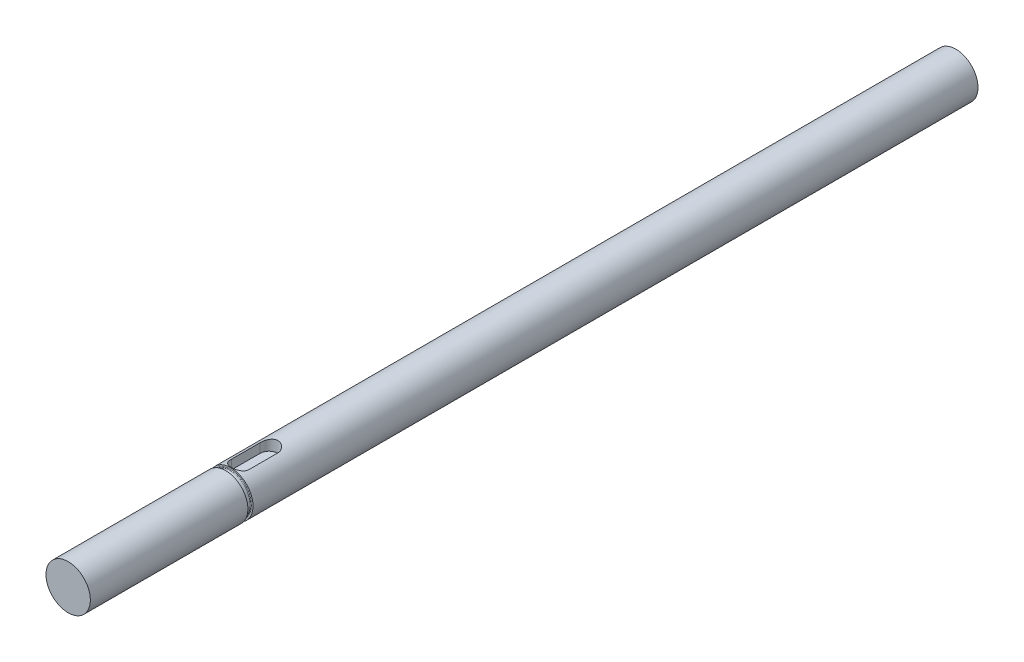
ISO-10303-21;
HEADER;
FILE_DESCRIPTION(('STEP AP214'),'2;1');
FILE_NAME('part.step','',(''),(''),'','','');
FILE_SCHEMA(('AUTOMOTIVE_DESIGN { 1 0 10303 214 1 1 1 1 }'));
ENDSEC;
DATA;
#1=APPLICATION_CONTEXT('core data for automotive mechanical design processes');
#2=APPLICATION_PROTOCOL_DEFINITION('international standard','automotive_design',2000,#1);
#3=PRODUCT_CONTEXT('',#1,'mechanical');
#4=PRODUCT('Part','Part','',(#3));
#5=PRODUCT_RELATED_PRODUCT_CATEGORY('part','',(#4));
#6=PRODUCT_DEFINITION_FORMATION('','',#4);
#7=PRODUCT_DEFINITION_CONTEXT('part definition',#1,'design');
#8=PRODUCT_DEFINITION('design','',#6,#7);
#9=PRODUCT_DEFINITION_SHAPE('','',#8);
#10=(LENGTH_UNIT() NAMED_UNIT(*) SI_UNIT(.MILLI.,.METRE.));
#11=(NAMED_UNIT(*) PLANE_ANGLE_UNIT() SI_UNIT($,.RADIAN.));
#12=(NAMED_UNIT(*) SI_UNIT($,.STERADIAN.) SOLID_ANGLE_UNIT());
#13=UNCERTAINTY_MEASURE_WITH_UNIT(LENGTH_MEASURE(1.E-05),#10,'distance_accuracy_value','');
#14=(GEOMETRIC_REPRESENTATION_CONTEXT(3) GLOBAL_UNCERTAINTY_ASSIGNED_CONTEXT((#13)) GLOBAL_UNIT_ASSIGNED_CONTEXT((#10,
#11,#12)) REPRESENTATION_CONTEXT('',''));
#15=CARTESIAN_POINT('',(0.,0.,0.));
#16=DIRECTION('',(0.,0.,1.));
#17=DIRECTION('',(1.,0.,0.));
#18=AXIS2_PLACEMENT_3D('',#15,#16,#17);
#19=CARTESIAN_POINT('',(0.,0.,100.));
#20=DIRECTION('',(0.,0.,-1.));
#21=DIRECTION('',(-1.,0.,0.));
#22=AXIS2_PLACEMENT_3D('',#19,#20,#21);
#23=CYLINDRICAL_SURFACE('',#22,5.);
#24=CARTESIAN_POINT('',(-1.99999999999998,4.58257569495585,61.25));
#25=CARTESIAN_POINT('',(-2.00000798036346,4.58256464470382,61.3038058525026));
#26=CARTESIAN_POINT('',(-1.99782891366023,4.58352306077323,61.3576056655577));
#27=CARTESIAN_POINT('',(-1.98915905973445,4.58729625417544,61.4647712982547));
#28=CARTESIAN_POINT('',(-1.98266991468791,4.59011032448546,61.518137275356));
#29=CARTESIAN_POINT('',(-1.96547603676368,4.5974978292064,61.6238468215588));
#30=CARTESIAN_POINT('',(-1.95478796820432,4.60206430717534,61.676193584044));
#31=CARTESIAN_POINT('',(-1.92931630190659,4.61280053296683,61.7797007717145));
#32=CARTESIAN_POINT('',(-1.91453245417089,4.61897037865399,61.8308611242772));
#33=CARTESIAN_POINT('',(-1.86426971793521,4.63959291248422,61.981935850582));
#34=CARTESIAN_POINT('',(-1.82284489460006,4.65617449157431,62.0796542306897));
#35=CARTESIAN_POINT('',(-1.72548191592175,4.69312370765381,62.2667955800826));
#36=CARTESIAN_POINT('',(-1.66952996336924,4.71349493864008,62.3562105529617));
#37=CARTESIAN_POINT('',(-1.54131835736853,4.75700999402115,62.5292623966742));
#38=CARTESIAN_POINT('',(-1.46836913992728,4.78024245635517,62.6123672169202));
#39=CARTESIAN_POINT('',(-1.30969646176207,4.82612790548656,62.7655402722107));
#40=CARTESIAN_POINT('',(-1.2239703849968,4.84878077249721,62.8356058308657));
#41=CARTESIAN_POINT('',(-1.03800590808967,4.89203417106082,62.9634063941957));
#42=CARTESIAN_POINT('',(-0.937327933050951,4.91251824543531,63.0205448092619));
#43=CARTESIAN_POINT('',(-0.7268241432467,4.94803944125004,63.1168440726887));
#44=CARTESIAN_POINT('',(-0.617002169026234,4.96307883544185,63.1560124240517));
#45=CARTESIAN_POINT('',(-0.39696744129568,4.98538314653816,63.2133412013106));
#46=CARTESIAN_POINT('',(-0.287031054523049,4.99298922547927,63.2324269509057));
#47=CARTESIAN_POINT('',(-0.0652684304565053,5.00080310201085,63.2520284799456));
#48=CARTESIAN_POINT('',(0.0465571232841751,5.0010135205303,63.2525508380235));
#49=CARTESIAN_POINT('',(0.262233376226791,4.99421960045302,63.2355171608401));
#50=CARTESIAN_POINT('',(0.366179202506797,4.98761985585461,63.218974953326));
#51=CARTESIAN_POINT('',(0.569674786500935,4.96849270441446,63.1700065729465));
#52=CARTESIAN_POINT('',(0.669224295072849,4.95596496209929,63.1375795011314));
#53=CARTESIAN_POINT('',(0.862897539070301,4.92596830598785,63.0573637035755));
#54=CARTESIAN_POINT('',(0.956916851366443,4.90842774755848,63.0093507591896));
#55=CARTESIAN_POINT('',(1.13580746919776,4.87014602008043,62.8995354114048));
#56=CARTESIAN_POINT('',(1.22067554984698,4.84940372896448,62.8377281703094));
#57=CARTESIAN_POINT('',(1.38476339273627,4.80521782746143,62.6973558197415));
#58=CARTESIAN_POINT('',(1.4632477030894,4.78168627172884,62.61795752533));
#59=CARTESIAN_POINT('',(1.60609926099478,4.7356195058465,62.4470199048523));
#60=CARTESIAN_POINT('',(1.67046007709005,4.71308475332783,62.3554750779057));
#61=CARTESIAN_POINT('',(1.78493657933605,4.67095688856025,62.1595297159788));
#62=CARTESIAN_POINT('',(1.83458932217622,4.65146702150583,62.0548351633398));
#63=CARTESIAN_POINT('',(1.91521298357264,4.61886105059582,61.8376384755705));
#64=CARTESIAN_POINT('',(1.94621696002208,4.60573367628738,61.7251505526617));
#65=CARTESIAN_POINT('',(1.9781058182572,4.59208303529493,61.551256365842));
#66=CARTESIAN_POINT('',(1.98630505165979,4.58853437680526,61.4913424506987));
#67=CARTESIAN_POINT('',(1.99725282103812,4.58377540314389,61.3709649810045));
#68=CARTESIAN_POINT('',(2.00000471568568,4.58256364711745,61.3105017882422));
#69=CARTESIAN_POINT('',(2.,4.58257569495584,61.25));
#70=B_SPLINE_CURVE_WITH_KNOTS('',3,(#24,#25,#26,#27,#28,#29,#30,#31,#32,#33,#34,#35,#36,#37,#38,
#39,#40,#41,#42,#43,#44,#45,#46,#47,#48,#49,#50,#51,#52,#53,#54,#55,#56,#57,#58,#59,#60,#61,#62,
#63,#64,#65,#66,#67,#68,#69),.UNSPECIFIED.,.F.,.F.,(4,2,2,2,2,2,2,2,2,2,2,2,2,2,2,2,2,2,2,2,2,2,
4),(0.,0.161354853098824,0.322648263883208,0.483307911251883,0.643977367092303,
0.964683001739086,1.28569434942625,1.62318047995497,1.96073580539189,2.31162858925762,
2.66237473197321,2.99613876504268,3.32978451514654,3.64468915259533,3.95961161305652,
4.27928176927544,4.59906421133017,4.9398187467515,5.28072813203931,5.63144241548458,
5.98153315592122,6.1630019255781,6.34435877193558),.UNSPECIFIED.);
#71=CARTESIAN_POINT('',(-1.99999999999998,4.58257569495585,61.25));
#72=VERTEX_POINT('',#71);
#73=CARTESIAN_POINT('',(2.,4.58257569495584,61.25));
#74=VERTEX_POINT('',#73);
#75=EDGE_CURVE('E115',#72,#74,#70,.T.);
#76=ORIENTED_EDGE('',*,*,#75,.F.);
#77=DIRECTION('',(0.,0.,-1.));
#78=VECTOR('',#77,1.);
#79=CARTESIAN_POINT('',(-2.,4.58257569495584,100.));
#80=LINE('',#79,#78);
#81=CARTESIAN_POINT('',(-1.99999999999999,4.58257569495584,54.75));
#82=VERTEX_POINT('',#81);
#83=EDGE_CURVE('E11',#82,#72,#80,.F.);
#84=ORIENTED_EDGE('',*,*,#83,.F.);
#85=CARTESIAN_POINT('',(2.,4.58257569495584,54.75));
#86=CARTESIAN_POINT('',(2.00000798036348,4.58256464470381,54.6961941474974));
#87=CARTESIAN_POINT('',(1.99782891366025,4.58352306077323,54.6423943344424));
#88=CARTESIAN_POINT('',(1.98915905973447,4.58729625417543,54.5352287017453));
#89=CARTESIAN_POINT('',(1.98266991468793,4.59011032448545,54.481862724644));
#90=CARTESIAN_POINT('',(1.9654760367637,4.59749782920639,54.3761531784412));
#91=CARTESIAN_POINT('',(1.95478796820434,4.60206430717533,54.323806415956));
#92=CARTESIAN_POINT('',(1.92931630190661,4.61280053296682,54.2202992282855));
#93=CARTESIAN_POINT('',(1.91453245417091,4.61897037865398,54.1691388757228));
#94=CARTESIAN_POINT('',(1.86426971793523,4.63959291248421,54.018064149418));
#95=CARTESIAN_POINT('',(1.82284489460008,4.6561744915743,53.9203457693103));
#96=CARTESIAN_POINT('',(1.72548191592177,4.6931237076538,53.7332044199174));
#97=CARTESIAN_POINT('',(1.66952996336926,4.71349493864007,53.6437894470384));
#98=CARTESIAN_POINT('',(1.54131835736855,4.75700999402114,53.4707376033258));
#99=CARTESIAN_POINT('',(1.46836913992731,4.78024245635516,53.3876327830798));
#100=CARTESIAN_POINT('',(1.30969646176209,4.82612790548656,53.2344597277893));
#101=CARTESIAN_POINT('',(1.22397038499682,4.84878077249721,53.1643941691343));
#102=CARTESIAN_POINT('',(1.03800590808969,4.89203417106082,53.0365936058044));
#103=CARTESIAN_POINT('',(0.937327933050968,4.91251824543531,52.9794551907381));
#104=CARTESIAN_POINT('',(0.726824143246719,4.94803944125003,52.8831559273114));
#105=CARTESIAN_POINT('',(0.617002169026255,4.96307883544185,52.8439875759483));
#106=CARTESIAN_POINT('',(0.396967441295703,4.98538314653816,52.7866587986894));
#107=CARTESIAN_POINT('',(0.287031054523071,4.99298922547927,52.7675730490944));
#108=CARTESIAN_POINT('',(0.0652684304565268,5.00080310201086,52.7479715200544));
#109=CARTESIAN_POINT('',(-0.046557123284154,5.0010135205303,52.7474491619765));
#110=CARTESIAN_POINT('',(-0.262233376226772,4.99421960045302,52.7644828391599));
#111=CARTESIAN_POINT('',(-0.366179202506779,4.98761985585461,52.781025046674));
#112=CARTESIAN_POINT('',(-0.569674786500916,4.96849270441446,52.8299934270536));
#113=CARTESIAN_POINT('',(-0.669224295072828,4.95596496209929,52.8624204988686));
#114=CARTESIAN_POINT('',(-0.86289753907028,4.92596830598785,52.9426362964245));
#115=CARTESIAN_POINT('',(-0.956916851366425,4.90842774755848,52.9906492408105));
#116=CARTESIAN_POINT('',(-1.13580746919775,4.87014602008043,53.1004645885952));
#117=CARTESIAN_POINT('',(-1.22067554984696,4.84940372896449,53.1622718296906));
#118=CARTESIAN_POINT('',(-1.38476339273625,4.80521782746144,53.3026441802585));
#119=CARTESIAN_POINT('',(-1.46324770308938,4.78168627172885,53.38204247467));
#120=CARTESIAN_POINT('',(-1.60609926099476,4.73561950584651,53.5529800951477));
#121=CARTESIAN_POINT('',(-1.67046007709003,4.71308475332784,53.6445249220943));
#122=CARTESIAN_POINT('',(-1.78493657933603,4.67095688856025,53.8404702840212));
#123=CARTESIAN_POINT('',(-1.8345893221762,4.65146702150584,53.9451648366602));
#124=CARTESIAN_POINT('',(-1.91521298357262,4.61886105059582,54.1623615244295));
#125=CARTESIAN_POINT('',(-1.94621696002206,4.60573367628739,54.2748494473383));
#126=CARTESIAN_POINT('',(-1.97810581825718,4.59208303529494,54.448743634158));
#127=CARTESIAN_POINT('',(-1.98630505165977,4.58853437680527,54.5086575493013));
#128=CARTESIAN_POINT('',(-1.99725282103809,4.5837754031439,54.6290350189955));
#129=CARTESIAN_POINT('',(-2.00000471568566,4.58256364711745,54.6894982117578));
#130=CARTESIAN_POINT('',(-1.99999999999998,4.58257569495585,54.75));
#131=B_SPLINE_CURVE_WITH_KNOTS('',3,(#85,#86,#87,#88,#89,#90,#91,#92,#93,#94,#95,#96,#97,#98,
#99,#100,#101,#102,#103,#104,#105,#106,#107,#108,#109,#110,#111,#112,#113,#114,#115,#116,#117,
#118,#119,#120,#121,#122,#123,#124,#125,#126,#127,#128,#129,#130),.UNSPECIFIED.,.F.,.F.,(4,2,2,
2,2,2,2,2,2,2,2,2,2,2,2,2,2,2,2,2,2,2,4),(0.,0.161354853098824,0.322648263883208,
0.483307911251883,0.643977367092303,0.964683001739087,1.28569434942625,1.62318047995497,
1.9607358053919,2.31162858925762,2.66237473197321,2.99613876504268,3.32978451514654,
3.64468915259533,3.95961161305652,4.27928176927545,4.59906421133017,4.9398187467515,
5.2807281320393,5.63144241548458,5.98153315592122,6.1630019255781,6.34435877193558),.UNSPECIFIED.);
#132=CARTESIAN_POINT('',(1.99999999999999,4.58257569495585,54.75));
#133=VERTEX_POINT('',#132);
#134=EDGE_CURVE('E60',#133,#82,#131,.T.);
#135=ORIENTED_EDGE('',*,*,#134,.F.);
#136=DIRECTION('',(0.,0.,-1.));
#137=VECTOR('',#136,1.);
#138=CARTESIAN_POINT('',(1.99999999999998,4.58257569495585,100.));
#139=LINE('',#138,#137);
#140=EDGE_CURVE('E44',#74,#133,#139,.T.);
#141=ORIENTED_EDGE('',*,*,#140,.F.);
#142=EDGE_LOOP('',(#76,#84,#135,#141));
#143=FACE_BOUND('',#142,.T.);
#144=CARTESIAN_POINT('',(0.,0.,-100.));
#145=DIRECTION('',(0.,0.,1.));
#146=DIRECTION('',(1.,0.,0.));
#147=AXIS2_PLACEMENT_3D('',#144,#145,#146);
#148=CIRCLE('',#147,5.);
#149=CARTESIAN_POINT('',(5.,0.,-100.));
#150=VERTEX_POINT('',#149);
#151=EDGE_CURVE('E84',#150,#150,#148,.T.);
#152=ORIENTED_EDGE('',*,*,#151,.T.);
#153=EDGE_LOOP('',(#152));
#154=FACE_BOUND('',#153,.T.);
#155=CARTESIAN_POINT('',(0.,0.,63.35));
#156=DIRECTION('',(0.,0.,1.));
#157=DIRECTION('',(0.,-1.,0.));
#158=AXIS2_PLACEMENT_3D('',#155,#156,#157);
#159=CIRCLE('',#158,5.);
#160=CARTESIAN_POINT('',(0.,-5.,63.35));
#161=VERTEX_POINT('',#160);
#162=EDGE_CURVE('E101',#161,#161,#159,.T.);
#163=ORIENTED_EDGE('',*,*,#162,.F.);
#164=EDGE_LOOP('',(#163));
#165=FACE_BOUND('',#164,.T.);
#166=ADVANCED_FACE('F34',(#143,#154,#165),#23,.T.);
#167=CARTESIAN_POINT('',(0.,0.,-100.));
#168=DIRECTION('',(0.,0.,1.));
#169=DIRECTION('',(1.,0.,0.));
#170=AXIS2_PLACEMENT_3D('',#167,#168,#169);
#171=PLANE('',#170);
#172=ORIENTED_EDGE('',*,*,#151,.F.);
#173=EDGE_LOOP('',(#172));
#174=FACE_BOUND('',#173,.T.);
#175=ADVANCED_FACE('F140',(#174),#171,.F.);
#176=CARTESIAN_POINT('',(0.,5.,54.75));
#177=DIRECTION('',(0.,-1.,0.));
#178=DIRECTION('',(0.,0.,-1.));
#179=AXIS2_PLACEMENT_3D('',#176,#177,#178);
#180=CYLINDRICAL_SURFACE('',#179,1.99999999999999);
#181=DIRECTION('',(0.,-1.,0.));
#182=VECTOR('',#181,1.);
#183=CARTESIAN_POINT('',(1.99999999999999,5.,54.75));
#184=LINE('',#183,#182);
#185=CARTESIAN_POINT('',(1.99999999999999,2.5,54.75));
#186=VERTEX_POINT('',#185);
#187=EDGE_CURVE('E108',#133,#186,#184,.T.);
#188=ORIENTED_EDGE('',*,*,#187,.F.);
#189=ORIENTED_EDGE('',*,*,#134,.T.);
#190=DIRECTION('',(0.,-1.,0.));
#191=VECTOR('',#190,1.);
#192=CARTESIAN_POINT('',(-1.99999999999999,5.,54.75));
#193=LINE('',#192,#191);
#194=CARTESIAN_POINT('',(-1.99999999999999,2.5,54.75));
#195=VERTEX_POINT('',#194);
#196=EDGE_CURVE('E77',#82,#195,#193,.T.);
#197=ORIENTED_EDGE('',*,*,#196,.T.);
#198=CARTESIAN_POINT('',(0.,2.5,54.75));
#199=DIRECTION('',(0.,1.,0.));
#200=DIRECTION('',(0.,0.,1.));
#201=AXIS2_PLACEMENT_3D('',#198,#199,#200);
#202=CIRCLE('',#201,1.99999999999999);
#203=EDGE_CURVE('E81',#186,#195,#202,.T.);
#204=ORIENTED_EDGE('',*,*,#203,.F.);
#205=EDGE_LOOP('',(#188,#189,#197,#204));
#206=FACE_BOUND('',#205,.T.);
#207=ADVANCED_FACE('F79',(#206),#180,.F.);
#208=CARTESIAN_POINT('',(-1.99999999999999,5.,54.75));
#209=DIRECTION('',(1.,0.,0.));
#210=DIRECTION('',(0.,0.,-1.));
#211=AXIS2_PLACEMENT_3D('',#208,#209,#210);
#212=PLANE('',#211);
#213=ORIENTED_EDGE('',*,*,#83,.T.);
#214=DIRECTION('',(0.,-1.,0.));
#215=VECTOR('',#214,1.);
#216=CARTESIAN_POINT('',(-1.99999999999998,5.,61.25));
#217=LINE('',#216,#215);
#218=CARTESIAN_POINT('',(-1.99999999999998,2.5,61.25));
#219=VERTEX_POINT('',#218);
#220=EDGE_CURVE('E85',#72,#219,#217,.T.);
#221=ORIENTED_EDGE('',*,*,#220,.T.);
#222=DIRECTION('',(0.,0.,1.));
#223=VECTOR('',#222,1.);
#224=CARTESIAN_POINT('',(-1.99999999999999,2.5,54.75));
#225=LINE('',#224,#223);
#226=EDGE_CURVE('E88',#195,#219,#225,.T.);
#227=ORIENTED_EDGE('',*,*,#226,.F.);
#228=ORIENTED_EDGE('',*,*,#196,.F.);
#229=EDGE_LOOP('',(#213,#221,#227,#228));
#230=FACE_BOUND('',#229,.T.);
#231=ADVANCED_FACE('F89',(#230),#212,.T.);
#232=CARTESIAN_POINT('',(0.,5.,61.25));
#233=DIRECTION('',(0.,-1.,0.));
#234=DIRECTION('',(0.,0.,-1.));
#235=AXIS2_PLACEMENT_3D('',#232,#233,#234);
#236=CYLINDRICAL_SURFACE('',#235,1.99999999999999);
#237=ORIENTED_EDGE('',*,*,#220,.F.);
#238=ORIENTED_EDGE('',*,*,#75,.T.);
#239=DIRECTION('',(0.,-1.,0.));
#240=VECTOR('',#239,1.);
#241=CARTESIAN_POINT('',(1.99999999999999,5.,61.25));
#242=LINE('',#241,#240);
#243=CARTESIAN_POINT('',(1.99999999999999,2.5,61.25));
#244=VERTEX_POINT('',#243);
#245=EDGE_CURVE('E52',#74,#244,#242,.T.);
#246=ORIENTED_EDGE('',*,*,#245,.T.);
#247=CARTESIAN_POINT('',(0.,2.5,61.25));
#248=DIRECTION('',(0.,1.,0.));
#249=DIRECTION('',(0.,0.,1.));
#250=AXIS2_PLACEMENT_3D('',#247,#248,#249);
#251=CIRCLE('',#250,1.99999999999999);
#252=EDGE_CURVE('E94',#219,#244,#251,.T.);
#253=ORIENTED_EDGE('',*,*,#252,.F.);
#254=EDGE_LOOP('',(#237,#238,#246,#253));
#255=FACE_BOUND('',#254,.T.);
#256=ADVANCED_FACE('F128',(#255),#236,.F.);
#257=CARTESIAN_POINT('',(1.99999999999999,5.,54.75));
#258=DIRECTION('',(-1.,0.,0.));
#259=DIRECTION('',(0.,0.,1.));
#260=AXIS2_PLACEMENT_3D('',#257,#258,#259);
#261=PLANE('',#260);
#262=ORIENTED_EDGE('',*,*,#140,.T.);
#263=ORIENTED_EDGE('',*,*,#187,.T.);
#264=DIRECTION('',(0.,0.,-1.));
#265=VECTOR('',#264,1.);
#266=CARTESIAN_POINT('',(1.99999999999999,2.5,54.75));
#267=LINE('',#266,#265);
#268=EDGE_CURVE('E98',#244,#186,#267,.T.);
#269=ORIENTED_EDGE('',*,*,#268,.F.);
#270=ORIENTED_EDGE('',*,*,#245,.F.);
#271=EDGE_LOOP('',(#262,#263,#269,#270));
#272=FACE_BOUND('',#271,.T.);
#273=ADVANCED_FACE('F133',(#272),#261,.T.);
#274=CARTESIAN_POINT('',(0.,2.5,54.75));
#275=DIRECTION('',(0.,1.,0.));
#276=DIRECTION('',(0.,0.,1.));
#277=AXIS2_PLACEMENT_3D('',#274,#275,#276);
#278=PLANE('',#277);
#279=ORIENTED_EDGE('',*,*,#203,.T.);
#280=ORIENTED_EDGE('',*,*,#226,.T.);
#281=ORIENTED_EDGE('',*,*,#252,.T.);
#282=ORIENTED_EDGE('',*,*,#268,.T.);
#283=EDGE_LOOP('',(#279,#280,#281,#282));
#284=FACE_BOUND('',#283,.T.);
#285=ADVANCED_FACE('F97',(#284),#278,.T.);
#286=CARTESIAN_POINT('',(0.,4.64999999999998,64.5));
#287=DIRECTION('',(0.,0.,-1.));
#288=DIRECTION('',(0.,1.,0.));
#289=AXIS2_PLACEMENT_3D('',#286,#287,#288);
#290=PLANE('',#289);
#291=CARTESIAN_POINT('',(0.,0.,64.5));
#292=DIRECTION('',(0.,0.,-1.));
#293=DIRECTION('',(0.,1.,0.));
#294=AXIS2_PLACEMENT_3D('',#291,#292,#293);
#295=CIRCLE('',#294,4.65000000000001);
#296=CARTESIAN_POINT('',(0.,4.64999999999998,64.5));
#297=VERTEX_POINT('',#296);
#298=EDGE_CURVE('E103',#297,#297,#295,.T.);
#299=ORIENTED_EDGE('',*,*,#298,.F.);
#300=EDGE_LOOP('',(#299));
#301=FACE_BOUND('',#300,.T.);
#302=CARTESIAN_POINT('',(0.,0.,64.5));
#303=DIRECTION('',(0.,0.,-1.));
#304=DIRECTION('',(0.,1.,0.));
#305=AXIS2_PLACEMENT_3D('',#302,#303,#304);
#306=CIRCLE('',#305,5.);
#307=CARTESIAN_POINT('',(0.,5.,64.5));
#308=VERTEX_POINT('',#307);
#309=EDGE_CURVE('E39',#308,#308,#306,.T.);
#310=ORIENTED_EDGE('',*,*,#309,.T.);
#311=EDGE_LOOP('',(#310));
#312=FACE_BOUND('',#311,.T.);
#313=ADVANCED_FACE('F164',(#301,#312),#290,.T.);
#314=CARTESIAN_POINT('',(0.,6.6414274466808,63.35));
#315=DIRECTION('',(0.,0.,1.));
#316=DIRECTION('',(0.,-1.,0.));
#317=AXIS2_PLACEMENT_3D('',#314,#315,#316);
#318=PLANE('',#317);
#319=CARTESIAN_POINT('',(0.,0.,63.35));
#320=DIRECTION('',(0.,0.,-1.));
#321=DIRECTION('',(0.,1.,0.));
#322=AXIS2_PLACEMENT_3D('',#319,#320,#321);
#323=CIRCLE('',#322,4.65000000000001);
#324=CARTESIAN_POINT('',(0.,4.64999999999998,63.35));
#325=VERTEX_POINT('',#324);
#326=EDGE_CURVE('E189',#325,#325,#323,.T.);
#327=ORIENTED_EDGE('',*,*,#326,.T.);
#328=EDGE_LOOP('',(#327));
#329=FACE_BOUND('',#328,.T.);
#330=ORIENTED_EDGE('',*,*,#162,.T.);
#331=EDGE_LOOP('',(#330));
#332=FACE_BOUND('',#331,.T.);
#333=ADVANCED_FACE('F168',(#329,#332),#318,.T.);
#334=CARTESIAN_POINT('',(0.,0.,64.35));
#335=DIRECTION('',(0.,0.,-1.));
#336=DIRECTION('',(0.,1.,0.));
#337=AXIS2_PLACEMENT_3D('',#334,#335,#336);
#338=TOROIDAL_SURFACE('',#337,4.65000000000001,0.149999999999998);
#339=ORIENTED_EDGE('',*,*,#298,.T.);
#340=EDGE_LOOP('',(#339));
#341=FACE_BOUND('',#340,.T.);
#342=CARTESIAN_POINT('',(0.,0.,64.35));
#343=DIRECTION('',(0.,0.,-1.));
#344=DIRECTION('',(0.,1.,0.));
#345=AXIS2_PLACEMENT_3D('',#342,#343,#344);
#346=CIRCLE('',#345,4.50000000000002);
#347=CARTESIAN_POINT('',(0.,4.49999999999998,64.35));
#348=VERTEX_POINT('',#347);
#349=EDGE_CURVE('E158',#348,#348,#346,.T.);
#350=ORIENTED_EDGE('',*,*,#349,.F.);
#351=EDGE_LOOP('',(#350));
#352=FACE_BOUND('',#351,.T.);
#353=ADVANCED_FACE('F172',(#341,#352),#338,.F.);
#354=CARTESIAN_POINT('',(0.,0.,150.));
#355=DIRECTION('',(0.,0.,-1.));
#356=DIRECTION('',(0.,1.,0.));
#357=AXIS2_PLACEMENT_3D('',#354,#355,#356);
#358=CYLINDRICAL_SURFACE('',#357,4.50000000000002);
#359=ORIENTED_EDGE('',*,*,#349,.T.);
#360=EDGE_LOOP('',(#359));
#361=FACE_BOUND('',#360,.T.);
#362=CARTESIAN_POINT('',(0.,0.,63.5));
#363=DIRECTION('',(0.,0.,-1.));
#364=DIRECTION('',(0.,1.,0.));
#365=AXIS2_PLACEMENT_3D('',#362,#363,#364);
#366=CIRCLE('',#365,4.50000000000002);
#367=CARTESIAN_POINT('',(0.,4.49999999999998,63.5));
#368=VERTEX_POINT('',#367);
#369=EDGE_CURVE('E191',#368,#368,#366,.T.);
#370=ORIENTED_EDGE('',*,*,#369,.F.);
#371=EDGE_LOOP('',(#370));
#372=FACE_BOUND('',#371,.T.);
#373=ADVANCED_FACE('F175',(#361,#372),#358,.T.);
#374=CARTESIAN_POINT('',(0.,0.,63.5));
#375=DIRECTION('',(0.,0.,-1.));
#376=DIRECTION('',(0.,1.,0.));
#377=AXIS2_PLACEMENT_3D('',#374,#375,#376);
#378=TOROIDAL_SURFACE('',#377,4.65000000000001,0.149999999999998);
#379=ORIENTED_EDGE('',*,*,#369,.T.);
#380=EDGE_LOOP('',(#379));
#381=FACE_BOUND('',#380,.T.);
#382=ORIENTED_EDGE('',*,*,#326,.F.);
#383=EDGE_LOOP('',(#382));
#384=FACE_BOUND('',#383,.T.);
#385=ADVANCED_FACE('F143',(#381,#384),#378,.F.);
#386=CARTESIAN_POINT('',(0.,0.,100.));
#387=DIRECTION('',(0.,0.,1.));
#388=DIRECTION('',(1.,0.,0.));
#389=AXIS2_PLACEMENT_3D('',#386,#387,#388);
#390=PLANE('',#389);
#391=CARTESIAN_POINT('',(0.,0.,100.));
#392=DIRECTION('',(0.,0.,1.));
#393=DIRECTION('',(1.,0.,0.));
#394=AXIS2_PLACEMENT_3D('',#391,#392,#393);
#395=CIRCLE('',#394,5.);
#396=CARTESIAN_POINT('',(5.,0.,100.));
#397=VERTEX_POINT('',#396);
#398=EDGE_CURVE('E112',#397,#397,#395,.T.);
#399=ORIENTED_EDGE('',*,*,#398,.T.);
#400=EDGE_LOOP('',(#399));
#401=FACE_BOUND('',#400,.T.);
#402=ADVANCED_FACE('F141',(#401),#390,.T.);
#403=ORIENTED_EDGE('',*,*,#398,.F.);
#404=EDGE_LOOP('',(#403));
#405=FACE_BOUND('',#404,.T.);
#406=ORIENTED_EDGE('',*,*,#309,.F.);
#407=EDGE_LOOP('',(#406));
#408=FACE_BOUND('',#407,.T.);
#409=ADVANCED_FACE('F36',(#405,#408),#23,.T.);
#410=CLOSED_SHELL('',(#166,#175,#207,#231,#256,#273,#285,#313,#333,#353,#373,#385,#402,#409));
#411=MANIFOLD_SOLID_BREP('B2',#410);
#412=ADVANCED_BREP_SHAPE_REPRESENTATION('',(#18,#411),#14);
#413=SHAPE_DEFINITION_REPRESENTATION(#9,#412);
ENDSEC;
END-ISO-10303-21;
